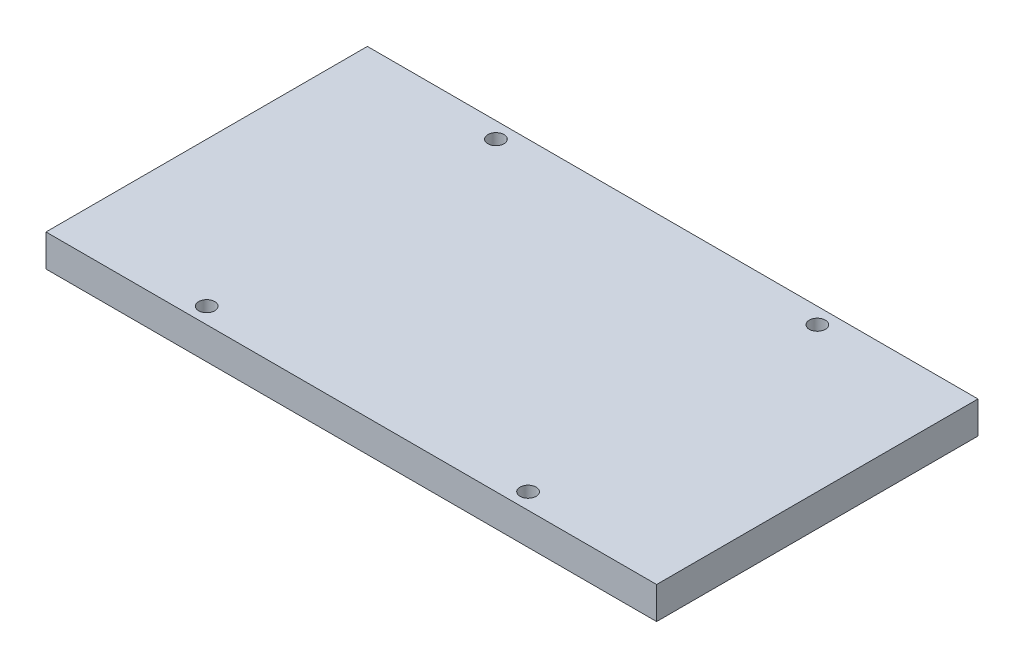
ISO-10303-21;
HEADER;
FILE_DESCRIPTION(('STEP AP214'),'2;1');
FILE_NAME('part.step','',(''),(''),'','','');
FILE_SCHEMA(('AUTOMOTIVE_DESIGN { 1 0 10303 214 1 1 1 1 }'));
ENDSEC;
DATA;
#1=APPLICATION_CONTEXT('core data for automotive mechanical design processes');
#2=APPLICATION_PROTOCOL_DEFINITION('international standard','automotive_design',2000,#1);
#3=PRODUCT_CONTEXT('',#1,'mechanical');
#4=PRODUCT('Part','Part','',(#3));
#5=PRODUCT_RELATED_PRODUCT_CATEGORY('part','',(#4));
#6=PRODUCT_DEFINITION_FORMATION('','',#4);
#7=PRODUCT_DEFINITION_CONTEXT('part definition',#1,'design');
#8=PRODUCT_DEFINITION('design','',#6,#7);
#9=PRODUCT_DEFINITION_SHAPE('','',#8);
#10=(LENGTH_UNIT() NAMED_UNIT(*) SI_UNIT(.MILLI.,.METRE.));
#11=(NAMED_UNIT(*) PLANE_ANGLE_UNIT() SI_UNIT($,.RADIAN.));
#12=(NAMED_UNIT(*) SI_UNIT($,.STERADIAN.) SOLID_ANGLE_UNIT());
#13=UNCERTAINTY_MEASURE_WITH_UNIT(LENGTH_MEASURE(1.E-05),#10,'distance_accuracy_value','');
#14=(GEOMETRIC_REPRESENTATION_CONTEXT(3) GLOBAL_UNCERTAINTY_ASSIGNED_CONTEXT((#13)) GLOBAL_UNIT_ASSIGNED_CONTEXT((#10,
#11,#12)) REPRESENTATION_CONTEXT('',''));
#15=CARTESIAN_POINT('',(0.,0.,0.));
#16=DIRECTION('',(0.,0.,1.));
#17=DIRECTION('',(1.,0.,0.));
#18=AXIS2_PLACEMENT_3D('',#15,#16,#17);
#19=CARTESIAN_POINT('',(482.6,50.8,-254.));
#20=DIRECTION('',(-1.,0.,0.));
#21=DIRECTION('',(0.,0.,1.));
#22=AXIS2_PLACEMENT_3D('',#19,#20,#21);
#23=PLANE('',#22);
#24=DIRECTION('',(0.,0.,-1.));
#25=VECTOR('',#24,1.);
#26=CARTESIAN_POINT('',(482.6,0.,-254.));
#27=LINE('',#26,#25);
#28=CARTESIAN_POINT('',(482.6,0.,254.));
#29=VERTEX_POINT('',#28);
#30=CARTESIAN_POINT('',(482.6,0.,-254.));
#31=VERTEX_POINT('',#30);
#32=EDGE_CURVE('E99',#29,#31,#27,.T.);
#33=ORIENTED_EDGE('',*,*,#32,.T.);
#34=DIRECTION('',(0.,-1.,0.));
#35=VECTOR('',#34,1.);
#36=CARTESIAN_POINT('',(482.6,50.8,-254.));
#37=LINE('',#36,#35);
#38=CARTESIAN_POINT('',(482.6,50.8,-254.));
#39=VERTEX_POINT('',#38);
#40=EDGE_CURVE('E11',#39,#31,#37,.T.);
#41=ORIENTED_EDGE('',*,*,#40,.F.);
#42=DIRECTION('',(0.,0.,-1.));
#43=VECTOR('',#42,1.);
#44=CARTESIAN_POINT('',(482.6,50.8,-254.));
#45=LINE('',#44,#43);
#46=CARTESIAN_POINT('',(482.6,50.8,254.));
#47=VERTEX_POINT('',#46);
#48=EDGE_CURVE('E87',#47,#39,#45,.T.);
#49=ORIENTED_EDGE('',*,*,#48,.F.);
#50=DIRECTION('',(0.,-1.,0.));
#51=VECTOR('',#50,1.);
#52=CARTESIAN_POINT('',(482.6,50.8,254.));
#53=LINE('',#52,#51);
#54=EDGE_CURVE('E95',#47,#29,#53,.T.);
#55=ORIENTED_EDGE('',*,*,#54,.T.);
#56=EDGE_LOOP('',(#33,#41,#49,#55));
#57=FACE_BOUND('',#56,.T.);
#58=ADVANCED_FACE('F36',(#57),#23,.F.);
#59=CARTESIAN_POINT('',(-482.6,50.8,-254.));
#60=DIRECTION('',(0.,0.,1.));
#61=DIRECTION('',(1.,0.,0.));
#62=AXIS2_PLACEMENT_3D('',#59,#60,#61);
#63=PLANE('',#62);
#64=DIRECTION('',(-1.,0.,0.));
#65=VECTOR('',#64,1.);
#66=CARTESIAN_POINT('',(-482.6,0.,-254.));
#67=LINE('',#66,#65);
#68=CARTESIAN_POINT('',(-482.6,0.,-254.));
#69=VERTEX_POINT('',#68);
#70=EDGE_CURVE('E91',#31,#69,#67,.T.);
#71=ORIENTED_EDGE('',*,*,#70,.T.);
#72=DIRECTION('',(0.,-1.,0.));
#73=VECTOR('',#72,1.);
#74=CARTESIAN_POINT('',(-482.6,50.8,-254.));
#75=LINE('',#74,#73);
#76=CARTESIAN_POINT('',(-482.6,50.8,-254.));
#77=VERTEX_POINT('',#76);
#78=EDGE_CURVE('E44',#77,#69,#75,.T.);
#79=ORIENTED_EDGE('',*,*,#78,.F.);
#80=DIRECTION('',(-1.,0.,0.));
#81=VECTOR('',#80,1.);
#82=CARTESIAN_POINT('',(-482.6,50.8,-254.));
#83=LINE('',#82,#81);
#84=EDGE_CURVE('E82',#39,#77,#83,.T.);
#85=ORIENTED_EDGE('',*,*,#84,.F.);
#86=ORIENTED_EDGE('',*,*,#40,.T.);
#87=EDGE_LOOP('',(#71,#79,#85,#86));
#88=FACE_BOUND('',#87,.T.);
#89=ADVANCED_FACE('F90',(#88),#63,.F.);
#90=CARTESIAN_POINT('',(-482.6,50.8,-254.));
#91=DIRECTION('',(1.,0.,0.));
#92=DIRECTION('',(0.,0.,-1.));
#93=AXIS2_PLACEMENT_3D('',#90,#91,#92);
#94=PLANE('',#93);
#95=DIRECTION('',(0.,0.,1.));
#96=VECTOR('',#95,1.);
#97=CARTESIAN_POINT('',(-482.6,0.,-254.));
#98=LINE('',#97,#96);
#99=CARTESIAN_POINT('',(-482.6,0.,254.));
#100=VERTEX_POINT('',#99);
#101=EDGE_CURVE('E69',#69,#100,#98,.T.);
#102=ORIENTED_EDGE('',*,*,#101,.T.);
#103=DIRECTION('',(0.,-1.,0.));
#104=VECTOR('',#103,1.);
#105=CARTESIAN_POINT('',(-482.6,50.8,254.));
#106=LINE('',#105,#104);
#107=CARTESIAN_POINT('',(-482.6,50.8,254.));
#108=VERTEX_POINT('',#107);
#109=EDGE_CURVE('E92',#108,#100,#106,.T.);
#110=ORIENTED_EDGE('',*,*,#109,.F.);
#111=DIRECTION('',(0.,0.,1.));
#112=VECTOR('',#111,1.);
#113=CARTESIAN_POINT('',(-482.6,50.8,-254.));
#114=LINE('',#113,#112);
#115=EDGE_CURVE('E85',#77,#108,#114,.T.);
#116=ORIENTED_EDGE('',*,*,#115,.F.);
#117=ORIENTED_EDGE('',*,*,#78,.T.);
#118=EDGE_LOOP('',(#102,#110,#116,#117));
#119=FACE_BOUND('',#118,.T.);
#120=ADVANCED_FACE('F93',(#119),#94,.F.);
#121=CARTESIAN_POINT('',(-482.6,50.8,254.));
#122=DIRECTION('',(0.,0.,-1.));
#123=DIRECTION('',(-1.,0.,0.));
#124=AXIS2_PLACEMENT_3D('',#121,#122,#123);
#125=PLANE('',#124);
#126=DIRECTION('',(1.,0.,0.));
#127=VECTOR('',#126,1.);
#128=CARTESIAN_POINT('',(-482.6,0.,254.));
#129=LINE('',#128,#127);
#130=EDGE_CURVE('E75',#100,#29,#129,.T.);
#131=ORIENTED_EDGE('',*,*,#130,.T.);
#132=ORIENTED_EDGE('',*,*,#54,.F.);
#133=DIRECTION('',(1.,0.,0.));
#134=VECTOR('',#133,1.);
#135=CARTESIAN_POINT('',(-482.6,50.8,254.));
#136=LINE('',#135,#134);
#137=EDGE_CURVE('E52',#108,#47,#136,.T.);
#138=ORIENTED_EDGE('',*,*,#137,.F.);
#139=ORIENTED_EDGE('',*,*,#109,.T.);
#140=EDGE_LOOP('',(#131,#132,#138,#139));
#141=FACE_BOUND('',#140,.T.);
#142=ADVANCED_FACE('F107',(#141),#125,.F.);
#143=CARTESIAN_POINT('',(0.,50.8,0.));
#144=DIRECTION('',(0.,1.,0.));
#145=DIRECTION('',(0.,0.,1.));
#146=AXIS2_PLACEMENT_3D('',#143,#144,#145);
#147=PLANE('',#146);
#148=CARTESIAN_POINT('',(254.,50.8,-228.6));
#149=DIRECTION('',(0.,1.,0.));
#150=DIRECTION('',(0.,0.,1.));
#151=AXIS2_PLACEMENT_3D('',#148,#149,#150);
#152=CIRCLE('',#151,12.7);
#153=CARTESIAN_POINT('',(254.,50.8,-215.9));
#154=VERTEX_POINT('',#153);
#155=EDGE_CURVE('E122',#154,#154,#152,.T.);
#156=ORIENTED_EDGE('',*,*,#155,.F.);
#157=EDGE_LOOP('',(#156));
#158=FACE_BOUND('',#157,.T.);
#159=CARTESIAN_POINT('',(254.,50.8,228.6));
#160=DIRECTION('',(0.,1.,0.));
#161=DIRECTION('',(0.,0.,1.));
#162=AXIS2_PLACEMENT_3D('',#159,#160,#161);
#163=CIRCLE('',#162,12.7);
#164=CARTESIAN_POINT('',(254.,50.8,241.3));
#165=VERTEX_POINT('',#164);
#166=EDGE_CURVE('E128',#165,#165,#163,.T.);
#167=ORIENTED_EDGE('',*,*,#166,.F.);
#168=EDGE_LOOP('',(#167));
#169=FACE_BOUND('',#168,.T.);
#170=CARTESIAN_POINT('',(-254.,50.8,228.6));
#171=DIRECTION('',(0.,1.,0.));
#172=DIRECTION('',(0.,0.,1.));
#173=AXIS2_PLACEMENT_3D('',#170,#171,#172);
#174=CIRCLE('',#173,12.7);
#175=CARTESIAN_POINT('',(-254.,50.8,241.3));
#176=VERTEX_POINT('',#175);
#177=EDGE_CURVE('E116',#176,#176,#174,.T.);
#178=ORIENTED_EDGE('',*,*,#177,.F.);
#179=EDGE_LOOP('',(#178));
#180=FACE_BOUND('',#179,.T.);
#181=CARTESIAN_POINT('',(-254.,50.8,-228.6));
#182=DIRECTION('',(0.,1.,0.));
#183=DIRECTION('',(0.,0.,1.));
#184=AXIS2_PLACEMENT_3D('',#181,#182,#183);
#185=CIRCLE('',#184,12.7);
#186=CARTESIAN_POINT('',(-254.,50.8,-215.9));
#187=VERTEX_POINT('',#186);
#188=EDGE_CURVE('E113',#187,#187,#185,.T.);
#189=ORIENTED_EDGE('',*,*,#188,.F.);
#190=EDGE_LOOP('',(#189));
#191=FACE_BOUND('',#190,.T.);
#192=ORIENTED_EDGE('',*,*,#48,.T.);
#193=ORIENTED_EDGE('',*,*,#84,.T.);
#194=ORIENTED_EDGE('',*,*,#115,.T.);
#195=ORIENTED_EDGE('',*,*,#137,.T.);
#196=EDGE_LOOP('',(#192,#193,#194,#195));
#197=FACE_BOUND('',#196,.T.);
#198=ADVANCED_FACE('F83',(#158,#169,#180,#191,#197),#147,.T.);
#199=CARTESIAN_POINT('',(0.,0.,0.));
#200=DIRECTION('',(0.,1.,0.));
#201=DIRECTION('',(0.,0.,1.));
#202=AXIS2_PLACEMENT_3D('',#199,#200,#201);
#203=PLANE('',#202);
#204=ORIENTED_EDGE('',*,*,#32,.F.);
#205=ORIENTED_EDGE('',*,*,#130,.F.);
#206=ORIENTED_EDGE('',*,*,#101,.F.);
#207=ORIENTED_EDGE('',*,*,#70,.F.);
#208=EDGE_LOOP('',(#204,#205,#206,#207));
#209=FACE_BOUND('',#208,.T.);
#210=ADVANCED_FACE('F110',(#209),#203,.F.);
#211=CARTESIAN_POINT('',(-254.,31.75,-228.6));
#212=DIRECTION('',(0.,1.,0.));
#213=DIRECTION('',(0.,0.,1.));
#214=AXIS2_PLACEMENT_3D('',#211,#212,#213);
#215=CYLINDRICAL_SURFACE('',#214,12.7);
#216=CARTESIAN_POINT('',(-254.,31.75,-228.6));
#217=DIRECTION('',(0.,1.,0.));
#218=DIRECTION('',(0.,0.,1.));
#219=AXIS2_PLACEMENT_3D('',#216,#217,#218);
#220=CIRCLE('',#219,12.7);
#221=CARTESIAN_POINT('',(-254.,31.75,-215.9));
#222=VERTEX_POINT('',#221);
#223=EDGE_CURVE('E102',#222,#222,#220,.T.);
#224=CARTESIAN_POINT('',(-254.,31.75,-215.9));
#225=CARTESIAN_POINT('',(-254.,31.9484375,-215.9));
#226=CARTESIAN_POINT('',(-254.,32.146875,-215.9));
#227=CARTESIAN_POINT('',(-254.,32.54375,-215.9));
#228=CARTESIAN_POINT('',(-254.,32.7421875,-215.9));
#229=CARTESIAN_POINT('',(-254.,33.1390625,-215.9));
#230=CARTESIAN_POINT('',(-254.,33.3375,-215.9));
#231=CARTESIAN_POINT('',(-254.,33.734375,-215.9));
#232=CARTESIAN_POINT('',(-254.,33.9328125,-215.9));
#233=CARTESIAN_POINT('',(-254.,34.3296875,-215.9));
#234=CARTESIAN_POINT('',(-254.,34.528125,-215.9));
#235=CARTESIAN_POINT('',(-254.,34.925,-215.9));
#236=CARTESIAN_POINT('',(-254.,35.1234375,-215.9));
#237=CARTESIAN_POINT('',(-254.,35.5203125,-215.9));
#238=CARTESIAN_POINT('',(-254.,35.71875,-215.9));
#239=CARTESIAN_POINT('',(-254.,36.115625,-215.9));
#240=CARTESIAN_POINT('',(-254.,36.3140625,-215.9));
#241=CARTESIAN_POINT('',(-254.,36.7109375,-215.9));
#242=CARTESIAN_POINT('',(-254.,36.909375,-215.9));
#243=CARTESIAN_POINT('',(-254.,37.30625,-215.9));
#244=CARTESIAN_POINT('',(-254.,37.5046875,-215.9));
#245=CARTESIAN_POINT('',(-254.,37.9015625,-215.9));
#246=CARTESIAN_POINT('',(-254.,38.1,-215.9));
#247=CARTESIAN_POINT('',(-254.,38.496875,-215.9));
#248=CARTESIAN_POINT('',(-254.,38.6953125,-215.9));
#249=CARTESIAN_POINT('',(-254.,39.0921875,-215.9));
#250=CARTESIAN_POINT('',(-254.,39.290625,-215.9));
#251=CARTESIAN_POINT('',(-254.,39.6875,-215.9));
#252=CARTESIAN_POINT('',(-254.,39.8859375,-215.9));
#253=CARTESIAN_POINT('',(-254.,40.2828125,-215.9));
#254=CARTESIAN_POINT('',(-254.,40.48125,-215.9));
#255=CARTESIAN_POINT('',(-254.,40.878125,-215.9));
#256=CARTESIAN_POINT('',(-254.,41.0765625,-215.9));
#257=CARTESIAN_POINT('',(-254.,41.4734375,-215.9));
#258=CARTESIAN_POINT('',(-254.,41.671875,-215.9));
#259=CARTESIAN_POINT('',(-254.,42.06875,-215.9));
#260=CARTESIAN_POINT('',(-254.,42.2671875,-215.9));
#261=CARTESIAN_POINT('',(-254.,42.6640625,-215.9));
#262=CARTESIAN_POINT('',(-254.,42.8625,-215.9));
#263=CARTESIAN_POINT('',(-254.,43.259375,-215.9));
#264=CARTESIAN_POINT('',(-254.,43.4578125,-215.9));
#265=CARTESIAN_POINT('',(-254.,43.8546875,-215.9));
#266=CARTESIAN_POINT('',(-254.,44.053125,-215.9));
#267=CARTESIAN_POINT('',(-254.,44.45,-215.9));
#268=CARTESIAN_POINT('',(-254.,44.6484375,-215.9));
#269=CARTESIAN_POINT('',(-254.,45.0453125,-215.9));
#270=CARTESIAN_POINT('',(-254.,45.24375,-215.9));
#271=CARTESIAN_POINT('',(-254.,45.640625,-215.9));
#272=CARTESIAN_POINT('',(-254.,45.8390625,-215.9));
#273=CARTESIAN_POINT('',(-254.,46.2359375,-215.9));
#274=CARTESIAN_POINT('',(-254.,46.434375,-215.9));
#275=CARTESIAN_POINT('',(-254.,46.83125,-215.9));
#276=CARTESIAN_POINT('',(-254.,47.0296875,-215.9));
#277=CARTESIAN_POINT('',(-254.,47.4265625,-215.9));
#278=CARTESIAN_POINT('',(-254.,47.625,-215.9));
#279=CARTESIAN_POINT('',(-254.,48.021875,-215.9));
#280=CARTESIAN_POINT('',(-254.,48.2203125,-215.9));
#281=CARTESIAN_POINT('',(-254.,48.6171875,-215.9));
#282=CARTESIAN_POINT('',(-254.,48.815625,-215.9));
#283=CARTESIAN_POINT('',(-254.,49.2125,-215.9));
#284=CARTESIAN_POINT('',(-254.,49.4109375,-215.9));
#285=CARTESIAN_POINT('',(-254.,49.8078125,-215.9));
#286=CARTESIAN_POINT('',(-254.,50.00625,-215.9));
#287=CARTESIAN_POINT('',(-254.,50.403125,-215.9));
#288=CARTESIAN_POINT('',(-254.,50.6015625,-215.9));
#289=CARTESIAN_POINT('',(-254.,50.8,-215.9));
#290=B_SPLINE_CURVE_WITH_KNOTS('',3,(#224,#225,#226,#227,#228,#229,#230,#231,#232,#233,#234,
#235,#236,#237,#238,#239,#240,#241,#242,#243,#244,#245,#246,#247,#248,#249,#250,#251,#252,#253,
#254,#255,#256,#257,#258,#259,#260,#261,#262,#263,#264,#265,#266,#267,#268,#269,#270,#271,#272,
#273,#274,#275,#276,#277,#278,#279,#280,#281,#282,#283,#284,#285,#286,#287,#288,#289),
.UNSPECIFIED.,.F.,.F.,(4,2,2,2,2,2,2,2,2,2,2,2,2,2,2,2,2,2,2,2,2,2,2,2,2,2,2,2,2,2,2,2,4),(0.,
0.5953125,1.190625,1.7859375,2.38125,2.9765625,3.571875,4.1671875,4.7625,5.3578125,5.953125,
6.5484375,7.14375,7.7390625,8.334375,8.9296875,9.525,10.1203125,10.715625,11.3109375,11.90625,
12.5015625,13.096875,13.6921875,14.2875,14.8828125,15.478125,16.0734375,16.66875,17.2640625,
17.859375,18.4546875,19.05),.UNSPECIFIED.);
#291=EDGE_CURVE('BSEAM145',#222,#187,#290,.T.);
#292=ORIENTED_EDGE('',*,*,#223,.F.);
#293=ORIENTED_EDGE('',*,*,#188,.T.);
#294=ORIENTED_EDGE('',*,*,#291,.T.);
#295=ORIENTED_EDGE('',*,*,#291,.F.);
#296=EDGE_LOOP('',(#292,#294,#293,#295));
#297=FACE_BOUND('',#296,.T.);
#298=ADVANCED_FACE('F145',(#297),#215,.F.);
#299=CARTESIAN_POINT('',(-254.,31.75,-228.6));
#300=DIRECTION('',(0.,1.,0.));
#301=DIRECTION('',(0.,0.,1.));
#302=AXIS2_PLACEMENT_3D('',#299,#300,#301);
#303=PLANE('',#302);
#304=ORIENTED_EDGE('',*,*,#223,.T.);
#305=EDGE_LOOP('',(#304));
#306=FACE_BOUND('',#305,.T.);
#307=ADVANCED_FACE('F147',(#306),#303,.T.);
#308=CARTESIAN_POINT('',(-254.,31.75,228.6));
#309=DIRECTION('',(0.,1.,0.));
#310=DIRECTION('',(0.,0.,1.));
#311=AXIS2_PLACEMENT_3D('',#308,#309,#310);
#312=CYLINDRICAL_SURFACE('',#311,12.7);
#313=CARTESIAN_POINT('',(-254.,31.75,228.6));
#314=DIRECTION('',(0.,1.,0.));
#315=DIRECTION('',(0.,0.,1.));
#316=AXIS2_PLACEMENT_3D('',#313,#314,#315);
#317=CIRCLE('',#316,12.7);
#318=CARTESIAN_POINT('',(-254.,31.75,241.3));
#319=VERTEX_POINT('',#318);
#320=EDGE_CURVE('E131',#319,#319,#317,.T.);
#321=CARTESIAN_POINT('',(-254.,31.75,241.3));
#322=CARTESIAN_POINT('',(-254.,31.9484375,241.3));
#323=CARTESIAN_POINT('',(-254.,32.146875,241.3));
#324=CARTESIAN_POINT('',(-254.,32.54375,241.3));
#325=CARTESIAN_POINT('',(-254.,32.7421875,241.3));
#326=CARTESIAN_POINT('',(-254.,33.1390625,241.3));
#327=CARTESIAN_POINT('',(-254.,33.3375,241.3));
#328=CARTESIAN_POINT('',(-254.,33.734375,241.3));
#329=CARTESIAN_POINT('',(-254.,33.9328125,241.3));
#330=CARTESIAN_POINT('',(-254.,34.3296875,241.3));
#331=CARTESIAN_POINT('',(-254.,34.528125,241.3));
#332=CARTESIAN_POINT('',(-254.,34.925,241.3));
#333=CARTESIAN_POINT('',(-254.,35.1234375,241.3));
#334=CARTESIAN_POINT('',(-254.,35.5203125,241.3));
#335=CARTESIAN_POINT('',(-254.,35.71875,241.3));
#336=CARTESIAN_POINT('',(-254.,36.115625,241.3));
#337=CARTESIAN_POINT('',(-254.,36.3140625,241.3));
#338=CARTESIAN_POINT('',(-254.,36.7109375,241.3));
#339=CARTESIAN_POINT('',(-254.,36.909375,241.3));
#340=CARTESIAN_POINT('',(-254.,37.30625,241.3));
#341=CARTESIAN_POINT('',(-254.,37.5046875,241.3));
#342=CARTESIAN_POINT('',(-254.,37.9015625,241.3));
#343=CARTESIAN_POINT('',(-254.,38.1,241.3));
#344=CARTESIAN_POINT('',(-254.,38.496875,241.3));
#345=CARTESIAN_POINT('',(-254.,38.6953125,241.3));
#346=CARTESIAN_POINT('',(-254.,39.0921875,241.3));
#347=CARTESIAN_POINT('',(-254.,39.290625,241.3));
#348=CARTESIAN_POINT('',(-254.,39.6875,241.3));
#349=CARTESIAN_POINT('',(-254.,39.8859375,241.3));
#350=CARTESIAN_POINT('',(-254.,40.2828125,241.3));
#351=CARTESIAN_POINT('',(-254.,40.48125,241.3));
#352=CARTESIAN_POINT('',(-254.,40.878125,241.3));
#353=CARTESIAN_POINT('',(-254.,41.0765625,241.3));
#354=CARTESIAN_POINT('',(-254.,41.4734375,241.3));
#355=CARTESIAN_POINT('',(-254.,41.671875,241.3));
#356=CARTESIAN_POINT('',(-254.,42.06875,241.3));
#357=CARTESIAN_POINT('',(-254.,42.2671875,241.3));
#358=CARTESIAN_POINT('',(-254.,42.6640625,241.3));
#359=CARTESIAN_POINT('',(-254.,42.8625,241.3));
#360=CARTESIAN_POINT('',(-254.,43.259375,241.3));
#361=CARTESIAN_POINT('',(-254.,43.4578125,241.3));
#362=CARTESIAN_POINT('',(-254.,43.8546875,241.3));
#363=CARTESIAN_POINT('',(-254.,44.053125,241.3));
#364=CARTESIAN_POINT('',(-254.,44.45,241.3));
#365=CARTESIAN_POINT('',(-254.,44.6484375,241.3));
#366=CARTESIAN_POINT('',(-254.,45.0453125,241.3));
#367=CARTESIAN_POINT('',(-254.,45.24375,241.3));
#368=CARTESIAN_POINT('',(-254.,45.640625,241.3));
#369=CARTESIAN_POINT('',(-254.,45.8390625,241.3));
#370=CARTESIAN_POINT('',(-254.,46.2359375,241.3));
#371=CARTESIAN_POINT('',(-254.,46.434375,241.3));
#372=CARTESIAN_POINT('',(-254.,46.83125,241.3));
#373=CARTESIAN_POINT('',(-254.,47.0296875,241.3));
#374=CARTESIAN_POINT('',(-254.,47.4265625,241.3));
#375=CARTESIAN_POINT('',(-254.,47.625,241.3));
#376=CARTESIAN_POINT('',(-254.,48.021875,241.3));
#377=CARTESIAN_POINT('',(-254.,48.2203125,241.3));
#378=CARTESIAN_POINT('',(-254.,48.6171875,241.3));
#379=CARTESIAN_POINT('',(-254.,48.815625,241.3));
#380=CARTESIAN_POINT('',(-254.,49.2125,241.3));
#381=CARTESIAN_POINT('',(-254.,49.4109375,241.3));
#382=CARTESIAN_POINT('',(-254.,49.8078125,241.3));
#383=CARTESIAN_POINT('',(-254.,50.00625,241.3));
#384=CARTESIAN_POINT('',(-254.,50.403125,241.3));
#385=CARTESIAN_POINT('',(-254.,50.6015625,241.3));
#386=CARTESIAN_POINT('',(-254.,50.8,241.3));
#387=B_SPLINE_CURVE_WITH_KNOTS('',3,(#321,#322,#323,#324,#325,#326,#327,#328,#329,#330,#331,
#332,#333,#334,#335,#336,#337,#338,#339,#340,#341,#342,#343,#344,#345,#346,#347,#348,#349,#350,
#351,#352,#353,#354,#355,#356,#357,#358,#359,#360,#361,#362,#363,#364,#365,#366,#367,#368,#369,
#370,#371,#372,#373,#374,#375,#376,#377,#378,#379,#380,#381,#382,#383,#384,#385,#386),
.UNSPECIFIED.,.F.,.F.,(4,2,2,2,2,2,2,2,2,2,2,2,2,2,2,2,2,2,2,2,2,2,2,2,2,2,2,2,2,2,2,2,4),(0.,
0.5953125,1.190625,1.7859375,2.38125,2.9765625,3.571875,4.1671875,4.7625,5.3578125,5.953125,
6.5484375,7.14375,7.7390625,8.334375,8.9296875,9.525,10.1203125,10.715625,11.3109375,11.90625,
12.5015625,13.096875,13.6921875,14.2875,14.8828125,15.478125,16.0734375,16.66875,17.2640625,
17.859375,18.4546875,19.05),.UNSPECIFIED.);
#388=EDGE_CURVE('BSEAM137',#319,#176,#387,.T.);
#389=ORIENTED_EDGE('',*,*,#320,.F.);
#390=ORIENTED_EDGE('',*,*,#177,.T.);
#391=ORIENTED_EDGE('',*,*,#388,.T.);
#392=ORIENTED_EDGE('',*,*,#388,.F.);
#393=EDGE_LOOP('',(#389,#391,#390,#392));
#394=FACE_BOUND('',#393,.T.);
#395=ADVANCED_FACE('F137',(#394),#312,.F.);
#396=CARTESIAN_POINT('',(-254.,31.75,228.6));
#397=DIRECTION('',(0.,1.,0.));
#398=DIRECTION('',(0.,0.,1.));
#399=AXIS2_PLACEMENT_3D('',#396,#397,#398);
#400=PLANE('',#399);
#401=ORIENTED_EDGE('',*,*,#320,.T.);
#402=EDGE_LOOP('',(#401));
#403=FACE_BOUND('',#402,.T.);
#404=ADVANCED_FACE('F201',(#403),#400,.T.);
#405=CARTESIAN_POINT('',(254.,31.75,228.6));
#406=DIRECTION('',(0.,1.,0.));
#407=DIRECTION('',(0.,0.,1.));
#408=AXIS2_PLACEMENT_3D('',#405,#406,#407);
#409=CYLINDRICAL_SURFACE('',#408,12.7);
#410=CARTESIAN_POINT('',(254.,31.75,228.6));
#411=DIRECTION('',(0.,1.,0.));
#412=DIRECTION('',(0.,0.,1.));
#413=AXIS2_PLACEMENT_3D('',#410,#411,#412);
#414=CIRCLE('',#413,12.7);
#415=CARTESIAN_POINT('',(254.,31.75,241.3));
#416=VERTEX_POINT('',#415);
#417=EDGE_CURVE('E125',#416,#416,#414,.T.);
#418=CARTESIAN_POINT('',(254.,31.75,241.3));
#419=CARTESIAN_POINT('',(254.,31.9484375,241.3));
#420=CARTESIAN_POINT('',(254.,32.146875,241.3));
#421=CARTESIAN_POINT('',(254.,32.54375,241.3));
#422=CARTESIAN_POINT('',(254.,32.7421875,241.3));
#423=CARTESIAN_POINT('',(254.,33.1390625,241.3));
#424=CARTESIAN_POINT('',(254.,33.3375,241.3));
#425=CARTESIAN_POINT('',(254.,33.734375,241.3));
#426=CARTESIAN_POINT('',(254.,33.9328125,241.3));
#427=CARTESIAN_POINT('',(254.,34.3296875,241.3));
#428=CARTESIAN_POINT('',(254.,34.528125,241.3));
#429=CARTESIAN_POINT('',(254.,34.925,241.3));
#430=CARTESIAN_POINT('',(254.,35.1234375,241.3));
#431=CARTESIAN_POINT('',(254.,35.5203125,241.3));
#432=CARTESIAN_POINT('',(254.,35.71875,241.3));
#433=CARTESIAN_POINT('',(254.,36.115625,241.3));
#434=CARTESIAN_POINT('',(254.,36.3140625,241.3));
#435=CARTESIAN_POINT('',(254.,36.7109375,241.3));
#436=CARTESIAN_POINT('',(254.,36.909375,241.3));
#437=CARTESIAN_POINT('',(254.,37.30625,241.3));
#438=CARTESIAN_POINT('',(254.,37.5046875,241.3));
#439=CARTESIAN_POINT('',(254.,37.9015625,241.3));
#440=CARTESIAN_POINT('',(254.,38.1,241.3));
#441=CARTESIAN_POINT('',(254.,38.496875,241.3));
#442=CARTESIAN_POINT('',(254.,38.6953125,241.3));
#443=CARTESIAN_POINT('',(254.,39.0921875,241.3));
#444=CARTESIAN_POINT('',(254.,39.290625,241.3));
#445=CARTESIAN_POINT('',(254.,39.6875,241.3));
#446=CARTESIAN_POINT('',(254.,39.8859375,241.3));
#447=CARTESIAN_POINT('',(254.,40.2828125,241.3));
#448=CARTESIAN_POINT('',(254.,40.48125,241.3));
#449=CARTESIAN_POINT('',(254.,40.878125,241.3));
#450=CARTESIAN_POINT('',(254.,41.0765625,241.3));
#451=CARTESIAN_POINT('',(254.,41.4734375,241.3));
#452=CARTESIAN_POINT('',(254.,41.671875,241.3));
#453=CARTESIAN_POINT('',(254.,42.06875,241.3));
#454=CARTESIAN_POINT('',(254.,42.2671875,241.3));
#455=CARTESIAN_POINT('',(254.,42.6640625,241.3));
#456=CARTESIAN_POINT('',(254.,42.8625,241.3));
#457=CARTESIAN_POINT('',(254.,43.259375,241.3));
#458=CARTESIAN_POINT('',(254.,43.4578125,241.3));
#459=CARTESIAN_POINT('',(254.,43.8546875,241.3));
#460=CARTESIAN_POINT('',(254.,44.053125,241.3));
#461=CARTESIAN_POINT('',(254.,44.45,241.3));
#462=CARTESIAN_POINT('',(254.,44.6484375,241.3));
#463=CARTESIAN_POINT('',(254.,45.0453125,241.3));
#464=CARTESIAN_POINT('',(254.,45.24375,241.3));
#465=CARTESIAN_POINT('',(254.,45.640625,241.3));
#466=CARTESIAN_POINT('',(254.,45.8390625,241.3));
#467=CARTESIAN_POINT('',(254.,46.2359375,241.3));
#468=CARTESIAN_POINT('',(254.,46.434375,241.3));
#469=CARTESIAN_POINT('',(254.,46.83125,241.3));
#470=CARTESIAN_POINT('',(254.,47.0296875,241.3));
#471=CARTESIAN_POINT('',(254.,47.4265625,241.3));
#472=CARTESIAN_POINT('',(254.,47.625,241.3));
#473=CARTESIAN_POINT('',(254.,48.021875,241.3));
#474=CARTESIAN_POINT('',(254.,48.2203125,241.3));
#475=CARTESIAN_POINT('',(254.,48.6171875,241.3));
#476=CARTESIAN_POINT('',(254.,48.815625,241.3));
#477=CARTESIAN_POINT('',(254.,49.2125,241.3));
#478=CARTESIAN_POINT('',(254.,49.4109375,241.3));
#479=CARTESIAN_POINT('',(254.,49.8078125,241.3));
#480=CARTESIAN_POINT('',(254.,50.00625,241.3));
#481=CARTESIAN_POINT('',(254.,50.403125,241.3));
#482=CARTESIAN_POINT('',(254.,50.6015625,241.3));
#483=CARTESIAN_POINT('',(254.,50.8,241.3));
#484=B_SPLINE_CURVE_WITH_KNOTS('',3,(#418,#419,#420,#421,#422,#423,#424,#425,#426,#427,#428,
#429,#430,#431,#432,#433,#434,#435,#436,#437,#438,#439,#440,#441,#442,#443,#444,#445,#446,#447,
#448,#449,#450,#451,#452,#453,#454,#455,#456,#457,#458,#459,#460,#461,#462,#463,#464,#465,#466,
#467,#468,#469,#470,#471,#472,#473,#474,#475,#476,#477,#478,#479,#480,#481,#482,#483),
.UNSPECIFIED.,.F.,.F.,(4,2,2,2,2,2,2,2,2,2,2,2,2,2,2,2,2,2,2,2,2,2,2,2,2,2,2,2,2,2,2,2,4),(0.,
0.5953125,1.190625,1.7859375,2.38125,2.9765625,3.571875,4.1671875,4.7625,5.3578125,5.953125,
6.5484375,7.14375,7.7390625,8.334375,8.9296875,9.525,10.1203125,10.715625,11.3109375,11.90625,
12.5015625,13.096875,13.6921875,14.2875,14.8828125,15.478125,16.0734375,16.66875,17.2640625,
17.859375,18.4546875,19.05),.UNSPECIFIED.);
#485=EDGE_CURVE('BSEAM210',#416,#165,#484,.T.);
#486=ORIENTED_EDGE('',*,*,#417,.F.);
#487=ORIENTED_EDGE('',*,*,#166,.T.);
#488=ORIENTED_EDGE('',*,*,#485,.T.);
#489=ORIENTED_EDGE('',*,*,#485,.F.);
#490=EDGE_LOOP('',(#486,#488,#487,#489));
#491=FACE_BOUND('',#490,.T.);
#492=ADVANCED_FACE('F210',(#491),#409,.F.);
#493=CARTESIAN_POINT('',(254.,31.75,228.6));
#494=DIRECTION('',(0.,1.,0.));
#495=DIRECTION('',(0.,0.,1.));
#496=AXIS2_PLACEMENT_3D('',#493,#494,#495);
#497=PLANE('',#496);
#498=ORIENTED_EDGE('',*,*,#417,.T.);
#499=EDGE_LOOP('',(#498));
#500=FACE_BOUND('',#499,.T.);
#501=ADVANCED_FACE('F219',(#500),#497,.T.);
#502=CARTESIAN_POINT('',(254.,31.75,-228.6));
#503=DIRECTION('',(0.,1.,0.));
#504=DIRECTION('',(0.,0.,1.));
#505=AXIS2_PLACEMENT_3D('',#502,#503,#504);
#506=CYLINDRICAL_SURFACE('',#505,12.7);
#507=CARTESIAN_POINT('',(254.,31.75,-228.6));
#508=DIRECTION('',(0.,1.,0.));
#509=DIRECTION('',(0.,0.,1.));
#510=AXIS2_PLACEMENT_3D('',#507,#508,#509);
#511=CIRCLE('',#510,12.7);
#512=CARTESIAN_POINT('',(254.,31.75,-215.9));
#513=VERTEX_POINT('',#512);
#514=EDGE_CURVE('E119',#513,#513,#511,.T.);
#515=CARTESIAN_POINT('',(254.,31.75,-215.9));
#516=CARTESIAN_POINT('',(254.,31.9484375,-215.9));
#517=CARTESIAN_POINT('',(254.,32.146875,-215.9));
#518=CARTESIAN_POINT('',(254.,32.54375,-215.9));
#519=CARTESIAN_POINT('',(254.,32.7421875,-215.9));
#520=CARTESIAN_POINT('',(254.,33.1390625,-215.9));
#521=CARTESIAN_POINT('',(254.,33.3375,-215.9));
#522=CARTESIAN_POINT('',(254.,33.734375,-215.9));
#523=CARTESIAN_POINT('',(254.,33.9328125,-215.9));
#524=CARTESIAN_POINT('',(254.,34.3296875,-215.9));
#525=CARTESIAN_POINT('',(254.,34.528125,-215.9));
#526=CARTESIAN_POINT('',(254.,34.925,-215.9));
#527=CARTESIAN_POINT('',(254.,35.1234375,-215.9));
#528=CARTESIAN_POINT('',(254.,35.5203125,-215.9));
#529=CARTESIAN_POINT('',(254.,35.71875,-215.9));
#530=CARTESIAN_POINT('',(254.,36.115625,-215.9));
#531=CARTESIAN_POINT('',(254.,36.3140625,-215.9));
#532=CARTESIAN_POINT('',(254.,36.7109375,-215.9));
#533=CARTESIAN_POINT('',(254.,36.909375,-215.9));
#534=CARTESIAN_POINT('',(254.,37.30625,-215.9));
#535=CARTESIAN_POINT('',(254.,37.5046875,-215.9));
#536=CARTESIAN_POINT('',(254.,37.9015625,-215.9));
#537=CARTESIAN_POINT('',(254.,38.1,-215.9));
#538=CARTESIAN_POINT('',(254.,38.496875,-215.9));
#539=CARTESIAN_POINT('',(254.,38.6953125,-215.9));
#540=CARTESIAN_POINT('',(254.,39.0921875,-215.9));
#541=CARTESIAN_POINT('',(254.,39.290625,-215.9));
#542=CARTESIAN_POINT('',(254.,39.6875,-215.9));
#543=CARTESIAN_POINT('',(254.,39.8859375,-215.9));
#544=CARTESIAN_POINT('',(254.,40.2828125,-215.9));
#545=CARTESIAN_POINT('',(254.,40.48125,-215.9));
#546=CARTESIAN_POINT('',(254.,40.878125,-215.9));
#547=CARTESIAN_POINT('',(254.,41.0765625,-215.9));
#548=CARTESIAN_POINT('',(254.,41.4734375,-215.9));
#549=CARTESIAN_POINT('',(254.,41.671875,-215.9));
#550=CARTESIAN_POINT('',(254.,42.06875,-215.9));
#551=CARTESIAN_POINT('',(254.,42.2671875,-215.9));
#552=CARTESIAN_POINT('',(254.,42.6640625,-215.9));
#553=CARTESIAN_POINT('',(254.,42.8625,-215.9));
#554=CARTESIAN_POINT('',(254.,43.259375,-215.9));
#555=CARTESIAN_POINT('',(254.,43.4578125,-215.9));
#556=CARTESIAN_POINT('',(254.,43.8546875,-215.9));
#557=CARTESIAN_POINT('',(254.,44.053125,-215.9));
#558=CARTESIAN_POINT('',(254.,44.45,-215.9));
#559=CARTESIAN_POINT('',(254.,44.6484375,-215.9));
#560=CARTESIAN_POINT('',(254.,45.0453125,-215.9));
#561=CARTESIAN_POINT('',(254.,45.24375,-215.9));
#562=CARTESIAN_POINT('',(254.,45.640625,-215.9));
#563=CARTESIAN_POINT('',(254.,45.8390625,-215.9));
#564=CARTESIAN_POINT('',(254.,46.2359375,-215.9));
#565=CARTESIAN_POINT('',(254.,46.434375,-215.9));
#566=CARTESIAN_POINT('',(254.,46.83125,-215.9));
#567=CARTESIAN_POINT('',(254.,47.0296875,-215.9));
#568=CARTESIAN_POINT('',(254.,47.4265625,-215.9));
#569=CARTESIAN_POINT('',(254.,47.625,-215.9));
#570=CARTESIAN_POINT('',(254.,48.021875,-215.9));
#571=CARTESIAN_POINT('',(254.,48.2203125,-215.9));
#572=CARTESIAN_POINT('',(254.,48.6171875,-215.9));
#573=CARTESIAN_POINT('',(254.,48.815625,-215.9));
#574=CARTESIAN_POINT('',(254.,49.2125,-215.9));
#575=CARTESIAN_POINT('',(254.,49.4109375,-215.9));
#576=CARTESIAN_POINT('',(254.,49.8078125,-215.9));
#577=CARTESIAN_POINT('',(254.,50.00625,-215.9));
#578=CARTESIAN_POINT('',(254.,50.403125,-215.9));
#579=CARTESIAN_POINT('',(254.,50.6015625,-215.9));
#580=CARTESIAN_POINT('',(254.,50.8,-215.9));
#581=B_SPLINE_CURVE_WITH_KNOTS('',3,(#515,#516,#517,#518,#519,#520,#521,#522,#523,#524,#525,
#526,#527,#528,#529,#530,#531,#532,#533,#534,#535,#536,#537,#538,#539,#540,#541,#542,#543,#544,
#545,#546,#547,#548,#549,#550,#551,#552,#553,#554,#555,#556,#557,#558,#559,#560,#561,#562,#563,
#564,#565,#566,#567,#568,#569,#570,#571,#572,#573,#574,#575,#576,#577,#578,#579,#580),
.UNSPECIFIED.,.F.,.F.,(4,2,2,2,2,2,2,2,2,2,2,2,2,2,2,2,2,2,2,2,2,2,2,2,2,2,2,2,2,2,2,2,4),(0.,
0.5953125,1.190625,1.7859375,2.38125,2.9765625,3.571875,4.1671875,4.7625,5.3578125,5.953125,
6.5484375,7.14375,7.7390625,8.334375,8.9296875,9.525,10.1203125,10.715625,11.3109375,11.90625,
12.5015625,13.096875,13.6921875,14.2875,14.8828125,15.478125,16.0734375,16.66875,17.2640625,
17.859375,18.4546875,19.05),.UNSPECIFIED.);
#582=EDGE_CURVE('BSEAM228',#513,#154,#581,.T.);
#583=ORIENTED_EDGE('',*,*,#514,.F.);
#584=ORIENTED_EDGE('',*,*,#155,.T.);
#585=ORIENTED_EDGE('',*,*,#582,.T.);
#586=ORIENTED_EDGE('',*,*,#582,.F.);
#587=EDGE_LOOP('',(#583,#585,#584,#586));
#588=FACE_BOUND('',#587,.T.);
#589=ADVANCED_FACE('F228',(#588),#506,.F.);
#590=CARTESIAN_POINT('',(254.,31.75,-228.6));
#591=DIRECTION('',(0.,1.,0.));
#592=DIRECTION('',(0.,0.,1.));
#593=AXIS2_PLACEMENT_3D('',#590,#591,#592);
#594=PLANE('',#593);
#595=ORIENTED_EDGE('',*,*,#514,.T.);
#596=EDGE_LOOP('',(#595));
#597=FACE_BOUND('',#596,.T.);
#598=ADVANCED_FACE('F237',(#597),#594,.T.);
#599=CLOSED_SHELL('',(#58,#89,#120,#142,#198,#210,#298,#307,#395,#404,#492,#501,#589,#598));
#600=MANIFOLD_SOLID_BREP('B2',#599);
#601=ADVANCED_BREP_SHAPE_REPRESENTATION('',(#18,#600),#14);
#602=SHAPE_DEFINITION_REPRESENTATION(#9,#601);
ENDSEC;
END-ISO-10303-21;
